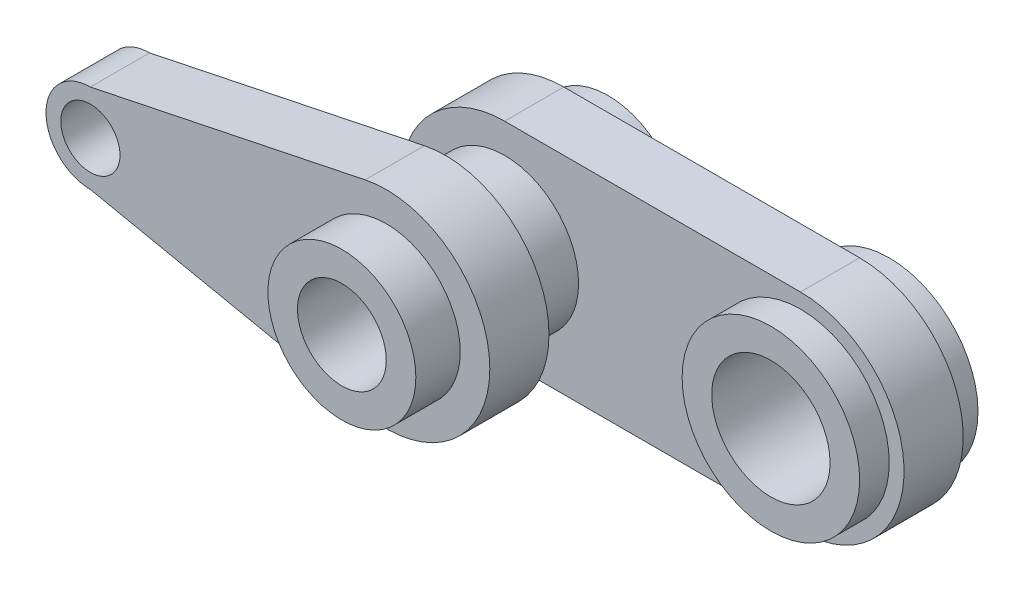
ISO-10303-21;
HEADER;
FILE_DESCRIPTION(('STEP AP214'),'2;1');
FILE_NAME('part.step','',(''),(''),'','','');
FILE_SCHEMA(('AUTOMOTIVE_DESIGN { 1 0 10303 214 1 1 1 1 }'));
ENDSEC;
DATA;
#1=APPLICATION_CONTEXT('core data for automotive mechanical design processes');
#2=APPLICATION_PROTOCOL_DEFINITION('international standard','automotive_design',2000,#1);
#3=PRODUCT_CONTEXT('',#1,'mechanical');
#4=PRODUCT('Part','Part','',(#3));
#5=PRODUCT_RELATED_PRODUCT_CATEGORY('part','',(#4));
#6=PRODUCT_DEFINITION_FORMATION('','',#4);
#7=PRODUCT_DEFINITION_CONTEXT('part definition',#1,'design');
#8=PRODUCT_DEFINITION('design','',#6,#7);
#9=PRODUCT_DEFINITION_SHAPE('','',#8);
#10=(LENGTH_UNIT() NAMED_UNIT(*) SI_UNIT(.MILLI.,.METRE.));
#11=(NAMED_UNIT(*) PLANE_ANGLE_UNIT() SI_UNIT($,.RADIAN.));
#12=(NAMED_UNIT(*) SI_UNIT($,.STERADIAN.) SOLID_ANGLE_UNIT());
#13=UNCERTAINTY_MEASURE_WITH_UNIT(LENGTH_MEASURE(1.E-05),#10,'distance_accuracy_value','');
#14=(GEOMETRIC_REPRESENTATION_CONTEXT(3) GLOBAL_UNCERTAINTY_ASSIGNED_CONTEXT((#13)) GLOBAL_UNIT_ASSIGNED_CONTEXT((#10,
#11,#12)) REPRESENTATION_CONTEXT('',''));
#15=CARTESIAN_POINT('',(0.,0.,0.));
#16=DIRECTION('',(0.,0.,1.));
#17=DIRECTION('',(1.,0.,0.));
#18=AXIS2_PLACEMENT_3D('',#15,#16,#17);
#19=CARTESIAN_POINT('',(-65.,35.,50.));
#20=DIRECTION('',(0.,0.,-1.));
#21=DIRECTION('',(-1.,0.,0.));
#22=AXIS2_PLACEMENT_3D('',#19,#20,#21);
#23=CYLINDRICAL_SURFACE('',#22,15.);
#24=CARTESIAN_POINT('',(-65.,35.,30.));
#25=DIRECTION('',(0.,0.,1.));
#26=DIRECTION('',(1.,0.,0.));
#27=AXIS2_PLACEMENT_3D('',#24,#25,#26);
#28=CIRCLE('',#27,15.);
#29=CARTESIAN_POINT('',(-65.,50.,30.));
#30=VERTEX_POINT('',#29);
#31=CARTESIAN_POINT('',(-65.,20.,30.));
#32=VERTEX_POINT('',#31);
#33=EDGE_CURVE('E118',#30,#32,#28,.T.);
#34=ORIENTED_EDGE('',*,*,#33,.T.);
#35=DIRECTION('',(0.,0.,-1.));
#36=VECTOR('',#35,1.);
#37=CARTESIAN_POINT('',(-65.,20.,50.));
#38=LINE('',#37,#36);
#39=CARTESIAN_POINT('',(-65.,20.,50.));
#40=VERTEX_POINT('',#39);
#41=EDGE_CURVE('E72',#40,#32,#38,.T.);
#42=ORIENTED_EDGE('',*,*,#41,.F.);
#43=CARTESIAN_POINT('',(-65.,35.,50.));
#44=DIRECTION('',(0.,0.,1.));
#45=DIRECTION('',(1.,0.,0.));
#46=AXIS2_PLACEMENT_3D('',#43,#44,#45);
#47=CIRCLE('',#46,15.);
#48=CARTESIAN_POINT('',(-65.,50.,50.));
#49=VERTEX_POINT('',#48);
#50=EDGE_CURVE('E109',#49,#40,#47,.T.);
#51=ORIENTED_EDGE('',*,*,#50,.F.);
#52=DIRECTION('',(0.,0.,-1.));
#53=VECTOR('',#52,1.);
#54=CARTESIAN_POINT('',(-65.,50.,50.));
#55=LINE('',#54,#53);
#56=EDGE_CURVE('E13',#49,#30,#55,.T.);
#57=ORIENTED_EDGE('',*,*,#56,.T.);
#58=EDGE_LOOP('',(#34,#42,#51,#57));
#59=FACE_BOUND('',#58,.T.);
#60=ADVANCED_FACE('F62',(#59),#23,.T.);
#61=CARTESIAN_POINT('',(1.29590710347776,6.24677964234695,50.));
#62=DIRECTION('',(0.203127144540267,0.979152369731554,0.));
#63=DIRECTION('',(-0.979152369731554,0.203127144540267,0.));
#64=AXIS2_PLACEMENT_3D('',#61,#62,#63);
#65=PLANE('',#64);
#66=DIRECTION('',(0.979152369731554,-0.203127144540267,0.));
#67=VECTOR('',#66,1.);
#68=CARTESIAN_POINT('',(1.29590710347776,6.24677964234695,30.));
#69=LINE('',#68,#67);
#70=CARTESIAN_POINT('',(27.8905499410907,0.729667059395615,30.));
#71=VERTEX_POINT('',#70);
#72=EDGE_CURVE('E96',#32,#71,#69,.T.);
#73=ORIENTED_EDGE('',*,*,#72,.T.);
#74=DIRECTION('',(0.,0.,-1.));
#75=VECTOR('',#74,1.);
#76=CARTESIAN_POINT('',(27.8905499410907,0.729667059395615,50.));
#77=LINE('',#76,#75);
#78=CARTESIAN_POINT('',(27.8905499410907,0.729667059395615,50.));
#79=VERTEX_POINT('',#78);
#80=EDGE_CURVE('E119',#79,#71,#77,.T.);
#81=ORIENTED_EDGE('',*,*,#80,.F.);
#82=DIRECTION('',(0.979152369731554,-0.203127144540267,0.));
#83=VECTOR('',#82,1.);
#84=CARTESIAN_POINT('',(1.29590710347776,6.24677964234695,50.));
#85=LINE('',#84,#83);
#86=EDGE_CURVE('E113',#40,#79,#85,.T.);
#87=ORIENTED_EDGE('',*,*,#86,.F.);
#88=ORIENTED_EDGE('',*,*,#41,.T.);
#89=EDGE_LOOP('',(#73,#81,#87,#88));
#90=FACE_BOUND('',#89,.T.);
#91=ADVANCED_FACE('F121',(#90),#65,.F.);
#92=CARTESIAN_POINT('',(35.,35.,50.));
#93=DIRECTION('',(0.,0.,-1.));
#94=DIRECTION('',(-1.,0.,0.));
#95=AXIS2_PLACEMENT_3D('',#92,#93,#94);
#96=CYLINDRICAL_SURFACE('',#95,35.);
#97=CARTESIAN_POINT('',(35.,35.,30.));
#98=DIRECTION('',(0.,0.,1.));
#99=DIRECTION('',(1.,0.,0.));
#100=AXIS2_PLACEMENT_3D('',#97,#98,#99);
#101=CIRCLE('',#100,35.);
#102=CARTESIAN_POINT('',(27.8905499410907,69.2703329406044,30.));
#103=VERTEX_POINT('',#102);
#104=EDGE_CURVE('E132',#71,#103,#101,.T.);
#105=ORIENTED_EDGE('',*,*,#104,.T.);
#106=DIRECTION('',(0.,0.,-1.));
#107=VECTOR('',#106,1.);
#108=CARTESIAN_POINT('',(27.8905499410907,69.2703329406044,50.));
#109=LINE('',#108,#107);
#110=CARTESIAN_POINT('',(27.8905499410907,69.2703329406044,50.));
#111=VERTEX_POINT('',#110);
#112=EDGE_CURVE('E103',#111,#103,#109,.T.);
#113=ORIENTED_EDGE('',*,*,#112,.F.);
#114=CARTESIAN_POINT('',(35.,35.,50.));
#115=DIRECTION('',(0.,0.,1.));
#116=DIRECTION('',(1.,0.,0.));
#117=AXIS2_PLACEMENT_3D('',#114,#115,#116);
#118=CIRCLE('',#117,35.);
#119=EDGE_CURVE('E80',#79,#111,#118,.T.);
#120=ORIENTED_EDGE('',*,*,#119,.F.);
#121=ORIENTED_EDGE('',*,*,#80,.T.);
#122=EDGE_LOOP('',(#105,#113,#120,#121));
#123=FACE_BOUND('',#122,.T.);
#124=ADVANCED_FACE('F137',(#123),#96,.T.);
#125=CARTESIAN_POINT('',(-12.6265626418607,60.8649757782173,50.));
#126=DIRECTION('',(-0.203127144540267,0.979152369731554,0.));
#127=DIRECTION('',(-0.979152369731554,-0.203127144540267,0.));
#128=AXIS2_PLACEMENT_3D('',#125,#126,#127);
#129=PLANE('',#128);
#130=DIRECTION('',(0.979152369731554,0.203127144540267,0.));
#131=VECTOR('',#130,1.);
#132=CARTESIAN_POINT('',(-12.6265626418607,60.8649757782173,30.));
#133=LINE('',#132,#131);
#134=EDGE_CURVE('E126',#30,#103,#133,.T.);
#135=ORIENTED_EDGE('',*,*,#134,.F.);
#136=ORIENTED_EDGE('',*,*,#56,.F.);
#137=DIRECTION('',(0.979152369731554,0.203127144540267,0.));
#138=VECTOR('',#137,1.);
#139=CARTESIAN_POINT('',(-12.6265626418607,60.8649757782173,50.));
#140=LINE('',#139,#138);
#141=EDGE_CURVE('E114',#49,#111,#140,.T.);
#142=ORIENTED_EDGE('',*,*,#141,.T.);
#143=ORIENTED_EDGE('',*,*,#112,.T.);
#144=EDGE_LOOP('',(#135,#136,#142,#143));
#145=FACE_BOUND('',#144,.T.);
#146=ADVANCED_FACE('F64',(#145),#129,.T.);
#147=CARTESIAN_POINT('',(0.,0.,30.));
#148=DIRECTION('',(0.,0.,1.));
#149=DIRECTION('',(1.,0.,0.));
#150=AXIS2_PLACEMENT_3D('',#147,#148,#149);
#151=PLANE('',#150);
#152=CARTESIAN_POINT('',(35.,35.,30.));
#153=DIRECTION('',(0.,0.,1.));
#154=DIRECTION('',(1.,0.,0.));
#155=AXIS2_PLACEMENT_3D('',#152,#153,#154);
#156=CIRCLE('',#155,15.);
#157=CARTESIAN_POINT('',(50.,35.,30.));
#158=VERTEX_POINT('',#157);
#159=EDGE_CURVE('E180',#158,#158,#156,.T.);
#160=ORIENTED_EDGE('',*,*,#159,.T.);
#161=EDGE_LOOP('',(#160));
#162=FACE_BOUND('',#161,.T.);
#163=CARTESIAN_POINT('',(-65.,35.,30.));
#164=DIRECTION('',(0.,0.,1.));
#165=DIRECTION('',(1.,0.,0.));
#166=AXIS2_PLACEMENT_3D('',#163,#164,#165);
#167=CIRCLE('',#166,10.);
#168=CARTESIAN_POINT('',(-55.,35.,30.));
#169=VERTEX_POINT('',#168);
#170=EDGE_CURVE('E183',#169,#169,#167,.T.);
#171=ORIENTED_EDGE('',*,*,#170,.T.);
#172=EDGE_LOOP('',(#171));
#173=FACE_BOUND('',#172,.T.);
#174=ORIENTED_EDGE('',*,*,#134,.T.);
#175=ORIENTED_EDGE('',*,*,#104,.F.);
#176=ORIENTED_EDGE('',*,*,#72,.F.);
#177=ORIENTED_EDGE('',*,*,#33,.F.);
#178=EDGE_LOOP('',(#174,#175,#176,#177));
#179=FACE_BOUND('',#178,.T.);
#180=ADVANCED_FACE('F139',(#162,#173,#179),#151,.F.);
#181=CARTESIAN_POINT('',(0.,0.,50.));
#182=DIRECTION('',(0.,0.,1.));
#183=DIRECTION('',(1.,0.,0.));
#184=AXIS2_PLACEMENT_3D('',#181,#182,#183);
#185=PLANE('',#184);
#186=CARTESIAN_POINT('',(-65.,35.,50.));
#187=DIRECTION('',(0.,0.,1.));
#188=DIRECTION('',(1.,0.,0.));
#189=AXIS2_PLACEMENT_3D('',#186,#187,#188);
#190=CIRCLE('',#189,10.);
#191=CARTESIAN_POINT('',(-55.,35.,50.));
#192=VERTEX_POINT('',#191);
#193=EDGE_CURVE('E66',#192,#192,#190,.T.);
#194=ORIENTED_EDGE('',*,*,#193,.F.);
#195=EDGE_LOOP('',(#194));
#196=FACE_BOUND('',#195,.T.);
#197=CARTESIAN_POINT('',(35.,35.,50.));
#198=DIRECTION('',(0.,0.,1.));
#199=DIRECTION('',(1.,0.,0.));
#200=AXIS2_PLACEMENT_3D('',#197,#198,#199);
#201=CIRCLE('',#200,25.);
#202=CARTESIAN_POINT('',(60.,35.,50.));
#203=VERTEX_POINT('',#202);
#204=EDGE_CURVE('E188',#203,#203,#201,.T.);
#205=ORIENTED_EDGE('',*,*,#204,.F.);
#206=EDGE_LOOP('',(#205));
#207=FACE_BOUND('',#206,.T.);
#208=ORIENTED_EDGE('',*,*,#141,.F.);
#209=ORIENTED_EDGE('',*,*,#50,.T.);
#210=ORIENTED_EDGE('',*,*,#86,.T.);
#211=ORIENTED_EDGE('',*,*,#119,.T.);
#212=EDGE_LOOP('',(#208,#209,#210,#211));
#213=FACE_BOUND('',#212,.T.);
#214=ADVANCED_FACE('F111',(#196,#207,#213),#185,.T.);
#215=CARTESIAN_POINT('',(35.,35.,65.));
#216=DIRECTION('',(0.,0.,-1.));
#217=DIRECTION('',(-1.,0.,0.));
#218=AXIS2_PLACEMENT_3D('',#215,#216,#217);
#219=CYLINDRICAL_SURFACE('',#218,25.);
#220=CARTESIAN_POINT('',(35.,35.,65.));
#221=DIRECTION('',(0.,0.,1.));
#222=DIRECTION('',(1.,0.,0.));
#223=AXIS2_PLACEMENT_3D('',#220,#221,#222);
#224=CIRCLE('',#223,25.);
#225=CARTESIAN_POINT('',(60.,35.,65.));
#226=VERTEX_POINT('',#225);
#227=EDGE_CURVE('E129',#226,#226,#224,.T.);
#228=ORIENTED_EDGE('',*,*,#227,.F.);
#229=EDGE_LOOP('',(#228));
#230=FACE_BOUND('',#229,.T.);
#231=ORIENTED_EDGE('',*,*,#204,.T.);
#232=EDGE_LOOP('',(#231));
#233=FACE_BOUND('',#232,.T.);
#234=ADVANCED_FACE('F156',(#230,#233),#219,.T.);
#235=CARTESIAN_POINT('',(35.,35.,65.));
#236=DIRECTION('',(0.,0.,1.));
#237=DIRECTION('',(1.,0.,0.));
#238=AXIS2_PLACEMENT_3D('',#235,#236,#237);
#239=PLANE('',#238);
#240=CARTESIAN_POINT('',(35.,35.,65.));
#241=DIRECTION('',(0.,0.,1.));
#242=DIRECTION('',(1.,0.,0.));
#243=AXIS2_PLACEMENT_3D('',#240,#241,#242);
#244=CIRCLE('',#243,15.);
#245=CARTESIAN_POINT('',(50.,35.,65.));
#246=VERTEX_POINT('',#245);
#247=EDGE_CURVE('E177',#246,#246,#244,.T.);
#248=ORIENTED_EDGE('',*,*,#247,.F.);
#249=EDGE_LOOP('',(#248));
#250=FACE_BOUND('',#249,.T.);
#251=ORIENTED_EDGE('',*,*,#227,.T.);
#252=EDGE_LOOP('',(#251));
#253=FACE_BOUND('',#252,.T.);
#254=ADVANCED_FACE('F160',(#250,#253),#239,.T.);
#255=CARTESIAN_POINT('',(35.,35.,-25.));
#256=DIRECTION('',(0.,0.,1.));
#257=DIRECTION('',(1.,0.,0.));
#258=AXIS2_PLACEMENT_3D('',#255,#256,#257);
#259=CYLINDRICAL_SURFACE('',#258,15.);
#260=CARTESIAN_POINT('',(50.,35.,65.));
#261=CARTESIAN_POINT('',(50.,35.,64.6354166666667));
#262=CARTESIAN_POINT('',(50.,35.,64.2708333333333));
#263=CARTESIAN_POINT('',(50.,35.,63.5416666666667));
#264=CARTESIAN_POINT('',(50.,35.,63.1770833333333));
#265=CARTESIAN_POINT('',(50.,35.,62.4479166666667));
#266=CARTESIAN_POINT('',(50.,35.,62.0833333333333));
#267=CARTESIAN_POINT('',(50.,35.,61.3541666666667));
#268=CARTESIAN_POINT('',(50.,35.,60.9895833333333));
#269=CARTESIAN_POINT('',(50.,35.,60.2604166666667));
#270=CARTESIAN_POINT('',(50.,35.,59.8958333333333));
#271=CARTESIAN_POINT('',(50.,35.,59.1666666666667));
#272=CARTESIAN_POINT('',(50.,35.,58.8020833333333));
#273=CARTESIAN_POINT('',(50.,35.,58.0729166666667));
#274=CARTESIAN_POINT('',(50.,35.,57.7083333333333));
#275=CARTESIAN_POINT('',(50.,35.,56.9791666666667));
#276=CARTESIAN_POINT('',(50.,35.,56.6145833333333));
#277=CARTESIAN_POINT('',(50.,35.,55.8854166666667));
#278=CARTESIAN_POINT('',(50.,35.,55.5208333333333));
#279=CARTESIAN_POINT('',(50.,35.,54.7916666666667));
#280=CARTESIAN_POINT('',(50.,35.,54.4270833333333));
#281=CARTESIAN_POINT('',(50.,35.,53.6979166666667));
#282=CARTESIAN_POINT('',(50.,35.,53.3333333333333));
#283=CARTESIAN_POINT('',(50.,35.,52.6041666666667));
#284=CARTESIAN_POINT('',(50.,35.,52.2395833333333));
#285=CARTESIAN_POINT('',(50.,35.,51.5104166666667));
#286=CARTESIAN_POINT('',(50.,35.,51.1458333333333));
#287=CARTESIAN_POINT('',(50.,35.,50.4166666666667));
#288=CARTESIAN_POINT('',(50.,35.,50.0520833333333));
#289=CARTESIAN_POINT('',(50.,35.,49.3229166666667));
#290=CARTESIAN_POINT('',(50.,35.,48.9583333333333));
#291=CARTESIAN_POINT('',(50.,35.,48.2291666666667));
#292=CARTESIAN_POINT('',(50.,35.,47.8645833333333));
#293=CARTESIAN_POINT('',(50.,35.,47.1354166666667));
#294=CARTESIAN_POINT('',(50.,35.,46.7708333333333));
#295=CARTESIAN_POINT('',(50.,35.,46.0416666666667));
#296=CARTESIAN_POINT('',(50.,35.,45.6770833333333));
#297=CARTESIAN_POINT('',(50.,35.,44.9479166666667));
#298=CARTESIAN_POINT('',(50.,35.,44.5833333333333));
#299=CARTESIAN_POINT('',(50.,35.,43.8541666666667));
#300=CARTESIAN_POINT('',(50.,35.,43.4895833333333));
#301=CARTESIAN_POINT('',(50.,35.,42.7604166666667));
#302=CARTESIAN_POINT('',(50.,35.,42.3958333333333));
#303=CARTESIAN_POINT('',(50.,35.,41.6666666666667));
#304=CARTESIAN_POINT('',(50.,35.,41.3020833333333));
#305=CARTESIAN_POINT('',(50.,35.,40.5729166666667));
#306=CARTESIAN_POINT('',(50.,35.,40.2083333333333));
#307=CARTESIAN_POINT('',(50.,35.,39.4791666666667));
#308=CARTESIAN_POINT('',(50.,35.,39.1145833333333));
#309=CARTESIAN_POINT('',(50.,35.,38.3854166666667));
#310=CARTESIAN_POINT('',(50.,35.,38.0208333333333));
#311=CARTESIAN_POINT('',(50.,35.,37.2916666666667));
#312=CARTESIAN_POINT('',(50.,35.,36.9270833333333));
#313=CARTESIAN_POINT('',(50.,35.,36.1979166666667));
#314=CARTESIAN_POINT('',(50.,35.,35.8333333333333));
#315=CARTESIAN_POINT('',(50.,35.,35.1041666666667));
#316=CARTESIAN_POINT('',(50.,35.,34.7395833333333));
#317=CARTESIAN_POINT('',(50.,35.,34.0104166666667));
#318=CARTESIAN_POINT('',(50.,35.,33.6458333333333));
#319=CARTESIAN_POINT('',(50.,35.,32.9166666666667));
#320=CARTESIAN_POINT('',(50.,35.,32.5520833333333));
#321=CARTESIAN_POINT('',(50.,35.,31.8229166666667));
#322=CARTESIAN_POINT('',(50.,35.,31.4583333333333));
#323=CARTESIAN_POINT('',(50.,35.,30.7291666666667));
#324=CARTESIAN_POINT('',(50.,35.,30.3645833333333));
#325=CARTESIAN_POINT('',(50.,35.,30.));
#326=B_SPLINE_CURVE_WITH_KNOTS('',3,(#260,#261,#262,#263,#264,#265,#266,#267,#268,#269,#270,
#271,#272,#273,#274,#275,#276,#277,#278,#279,#280,#281,#282,#283,#284,#285,#286,#287,#288,#289,
#290,#291,#292,#293,#294,#295,#296,#297,#298,#299,#300,#301,#302,#303,#304,#305,#306,#307,#308,
#309,#310,#311,#312,#313,#314,#315,#316,#317,#318,#319,#320,#321,#322,#323,#324,#325),
.UNSPECIFIED.,.F.,.F.,(4,2,2,2,2,2,2,2,2,2,2,2,2,2,2,2,2,2,2,2,2,2,2,2,2,2,2,2,2,2,2,2,4),(0.,
1.09375,2.1875,3.28125,4.375,5.46874999999999,6.5625,7.65625,8.75000000000001,9.84375,10.9375,
12.03125,13.125,14.21875,15.3125,16.40625,17.5,18.59375,19.6875,20.78125,21.875,22.96875,
24.0625,25.15625,26.25,27.34375,28.4375,29.53125,30.625,31.71875,32.8125,33.90625,35.),.UNSPECIFIED.);
#327=EDGE_CURVE('BSEAM164',#246,#158,#326,.T.);
#328=ORIENTED_EDGE('',*,*,#247,.T.);
#329=ORIENTED_EDGE('',*,*,#159,.F.);
#330=ORIENTED_EDGE('',*,*,#327,.T.);
#331=ORIENTED_EDGE('',*,*,#327,.F.);
#332=EDGE_LOOP('',(#328,#330,#329,#331));
#333=FACE_BOUND('',#332,.T.);
#334=ADVANCED_FACE('F164',(#333),#259,.F.);
#335=CARTESIAN_POINT('',(-65.,35.,-25.));
#336=DIRECTION('',(0.,0.,1.));
#337=DIRECTION('',(1.,0.,0.));
#338=AXIS2_PLACEMENT_3D('',#335,#336,#337);
#339=CYLINDRICAL_SURFACE('',#338,10.);
#340=CARTESIAN_POINT('',(-55.,35.,50.));
#341=CARTESIAN_POINT('',(-55.,35.,49.7916666666667));
#342=CARTESIAN_POINT('',(-55.,35.,49.5833333333333));
#343=CARTESIAN_POINT('',(-55.,35.,49.1666666666667));
#344=CARTESIAN_POINT('',(-55.,35.,48.9583333333333));
#345=CARTESIAN_POINT('',(-55.,35.,48.5416666666667));
#346=CARTESIAN_POINT('',(-55.,35.,48.3333333333333));
#347=CARTESIAN_POINT('',(-55.,35.,47.9166666666667));
#348=CARTESIAN_POINT('',(-55.,35.,47.7083333333333));
#349=CARTESIAN_POINT('',(-55.,35.,47.2916666666667));
#350=CARTESIAN_POINT('',(-55.,35.,47.0833333333333));
#351=CARTESIAN_POINT('',(-55.,35.,46.6666666666667));
#352=CARTESIAN_POINT('',(-55.,35.,46.4583333333333));
#353=CARTESIAN_POINT('',(-55.,35.,46.0416666666667));
#354=CARTESIAN_POINT('',(-55.,35.,45.8333333333333));
#355=CARTESIAN_POINT('',(-55.,35.,45.4166666666667));
#356=CARTESIAN_POINT('',(-55.,35.,45.2083333333333));
#357=CARTESIAN_POINT('',(-55.,35.,44.7916666666667));
#358=CARTESIAN_POINT('',(-55.,35.,44.5833333333333));
#359=CARTESIAN_POINT('',(-55.,35.,44.1666666666667));
#360=CARTESIAN_POINT('',(-55.,35.,43.9583333333333));
#361=CARTESIAN_POINT('',(-55.,35.,43.5416666666667));
#362=CARTESIAN_POINT('',(-55.,35.,43.3333333333333));
#363=CARTESIAN_POINT('',(-55.,35.,42.9166666666667));
#364=CARTESIAN_POINT('',(-55.,35.,42.7083333333333));
#365=CARTESIAN_POINT('',(-55.,35.,42.2916666666667));
#366=CARTESIAN_POINT('',(-55.,35.,42.0833333333333));
#367=CARTESIAN_POINT('',(-55.,35.,41.6666666666667));
#368=CARTESIAN_POINT('',(-55.,35.,41.4583333333333));
#369=CARTESIAN_POINT('',(-55.,35.,41.0416666666667));
#370=CARTESIAN_POINT('',(-55.,35.,40.8333333333333));
#371=CARTESIAN_POINT('',(-55.,35.,40.4166666666667));
#372=CARTESIAN_POINT('',(-55.,35.,40.2083333333333));
#373=CARTESIAN_POINT('',(-55.,35.,39.7916666666667));
#374=CARTESIAN_POINT('',(-55.,35.,39.5833333333333));
#375=CARTESIAN_POINT('',(-55.,35.,39.1666666666667));
#376=CARTESIAN_POINT('',(-55.,35.,38.9583333333333));
#377=CARTESIAN_POINT('',(-55.,35.,38.5416666666667));
#378=CARTESIAN_POINT('',(-55.,35.,38.3333333333333));
#379=CARTESIAN_POINT('',(-55.,35.,37.9166666666667));
#380=CARTESIAN_POINT('',(-55.,35.,37.7083333333333));
#381=CARTESIAN_POINT('',(-55.,35.,37.2916666666667));
#382=CARTESIAN_POINT('',(-55.,35.,37.0833333333333));
#383=CARTESIAN_POINT('',(-55.,35.,36.6666666666667));
#384=CARTESIAN_POINT('',(-55.,35.,36.4583333333333));
#385=CARTESIAN_POINT('',(-55.,35.,36.0416666666667));
#386=CARTESIAN_POINT('',(-55.,35.,35.8333333333333));
#387=CARTESIAN_POINT('',(-55.,35.,35.4166666666667));
#388=CARTESIAN_POINT('',(-55.,35.,35.2083333333333));
#389=CARTESIAN_POINT('',(-55.,35.,34.7916666666667));
#390=CARTESIAN_POINT('',(-55.,35.,34.5833333333333));
#391=CARTESIAN_POINT('',(-55.,35.,34.1666666666667));
#392=CARTESIAN_POINT('',(-55.,35.,33.9583333333333));
#393=CARTESIAN_POINT('',(-55.,35.,33.5416666666667));
#394=CARTESIAN_POINT('',(-55.,35.,33.3333333333333));
#395=CARTESIAN_POINT('',(-55.,35.,32.9166666666667));
#396=CARTESIAN_POINT('',(-55.,35.,32.7083333333333));
#397=CARTESIAN_POINT('',(-55.,35.,32.2916666666667));
#398=CARTESIAN_POINT('',(-55.,35.,32.0833333333333));
#399=CARTESIAN_POINT('',(-55.,35.,31.6666666666667));
#400=CARTESIAN_POINT('',(-55.,35.,31.4583333333333));
#401=CARTESIAN_POINT('',(-55.,35.,31.0416666666667));
#402=CARTESIAN_POINT('',(-55.,35.,30.8333333333333));
#403=CARTESIAN_POINT('',(-55.,35.,30.4166666666667));
#404=CARTESIAN_POINT('',(-55.,35.,30.2083333333333));
#405=CARTESIAN_POINT('',(-55.,35.,30.));
#406=B_SPLINE_CURVE_WITH_KNOTS('',3,(#340,#341,#342,#343,#344,#345,#346,#347,#348,#349,#350,
#351,#352,#353,#354,#355,#356,#357,#358,#359,#360,#361,#362,#363,#364,#365,#366,#367,#368,#369,
#370,#371,#372,#373,#374,#375,#376,#377,#378,#379,#380,#381,#382,#383,#384,#385,#386,#387,#388,
#389,#390,#391,#392,#393,#394,#395,#396,#397,#398,#399,#400,#401,#402,#403,#404,#405),
.UNSPECIFIED.,.F.,.F.,(4,2,2,2,2,2,2,2,2,2,2,2,2,2,2,2,2,2,2,2,2,2,2,2,2,2,2,2,2,2,2,2,4),(0.,
0.625000000000001,1.25,1.875,2.5,3.125,3.75,4.375,5.,5.62500000000001,6.25000000000001,
6.87500000000001,7.50000000000001,8.12500000000001,8.75000000000001,9.37500000000001,10.,10.625,
11.25,11.875,12.5,13.125,13.75,14.375,15.,15.625,16.25,16.875,17.5,18.125,18.75,19.375,20.),.UNSPECIFIED.);
#407=EDGE_CURVE('BSEAM166',#192,#169,#406,.T.);
#408=ORIENTED_EDGE('',*,*,#193,.T.);
#409=ORIENTED_EDGE('',*,*,#170,.F.);
#410=ORIENTED_EDGE('',*,*,#407,.T.);
#411=ORIENTED_EDGE('',*,*,#407,.F.);
#412=EDGE_LOOP('',(#408,#410,#409,#411));
#413=FACE_BOUND('',#412,.T.);
#414=ADVANCED_FACE('F166',(#413),#339,.F.);
#415=CLOSED_SHELL('',(#60,#91,#124,#146,#180,#214,#234,#254,#334,#414));
#416=MANIFOLD_SOLID_BREP('B2',#415);
#417=CARTESIAN_POINT('',(35.,35.,10.));
#418=DIRECTION('',(0.,0.,-1.));
#419=DIRECTION('',(-1.,0.,0.));
#420=AXIS2_PLACEMENT_3D('',#417,#418,#419);
#421=CYLINDRICAL_SURFACE('',#420,35.);
#422=DIRECTION('',(0.,0.,-1.));
#423=VECTOR('',#422,1.);
#424=CARTESIAN_POINT('',(35.,0.,10.));
#425=LINE('',#424,#423);
#426=CARTESIAN_POINT('',(35.,0.,10.));
#427=VERTEX_POINT('',#426);
#428=CARTESIAN_POINT('',(35.,0.,-10.));
#429=VERTEX_POINT('',#428);
#430=EDGE_CURVE('E323',#427,#429,#425,.T.);
#431=ORIENTED_EDGE('',*,*,#430,.F.);
#432=CARTESIAN_POINT('',(35.,35.,10.));
#433=DIRECTION('',(0.,0.,1.));
#434=DIRECTION('',(1.,0.,0.));
#435=AXIS2_PLACEMENT_3D('',#432,#433,#434);
#436=CIRCLE('',#435,35.);
#437=CARTESIAN_POINT('',(35.,70.,10.));
#438=VERTEX_POINT('',#437);
#439=EDGE_CURVE('E294',#438,#427,#436,.T.);
#440=ORIENTED_EDGE('',*,*,#439,.F.);
#441=DIRECTION('',(0.,0.,-1.));
#442=VECTOR('',#441,1.);
#443=CARTESIAN_POINT('',(35.,70.,10.));
#444=LINE('',#443,#442);
#445=CARTESIAN_POINT('',(35.,70.,-10.));
#446=VERTEX_POINT('',#445);
#447=EDGE_CURVE('E346',#446,#438,#444,.F.);
#448=ORIENTED_EDGE('',*,*,#447,.F.);
#449=CARTESIAN_POINT('',(35.,35.,-10.));
#450=DIRECTION('',(0.,0.,1.));
#451=DIRECTION('',(1.,0.,0.));
#452=AXIS2_PLACEMENT_3D('',#449,#450,#451);
#453=CIRCLE('',#452,35.);
#454=EDGE_CURVE('E287',#429,#446,#453,.F.);
#455=ORIENTED_EDGE('',*,*,#454,.F.);
#456=EDGE_LOOP('',(#431,#440,#448,#455));
#457=FACE_BOUND('',#456,.T.);
#458=ADVANCED_FACE('F270',(#457),#421,.T.);
#459=CARTESIAN_POINT('',(135.,35.,10.));
#460=DIRECTION('',(0.,0.,-1.));
#461=DIRECTION('',(-1.,0.,0.));
#462=AXIS2_PLACEMENT_3D('',#459,#460,#461);
#463=CYLINDRICAL_SURFACE('',#462,35.);
#464=DIRECTION('',(0.,0.,-1.));
#465=VECTOR('',#464,1.);
#466=CARTESIAN_POINT('',(135.,70.,10.));
#467=LINE('',#466,#465);
#468=CARTESIAN_POINT('',(135.,70.,10.));
#469=VERTEX_POINT('',#468);
#470=CARTESIAN_POINT('',(135.,70.,-10.));
#471=VERTEX_POINT('',#470);
#472=EDGE_CURVE('E319',#469,#471,#467,.T.);
#473=ORIENTED_EDGE('',*,*,#472,.F.);
#474=CARTESIAN_POINT('',(135.,35.,10.));
#475=DIRECTION('',(0.,0.,1.));
#476=DIRECTION('',(1.,0.,0.));
#477=AXIS2_PLACEMENT_3D('',#474,#475,#476);
#478=CIRCLE('',#477,35.);
#479=CARTESIAN_POINT('',(135.,0.,10.));
#480=VERTEX_POINT('',#479);
#481=EDGE_CURVE('E324',#480,#469,#478,.T.);
#482=ORIENTED_EDGE('',*,*,#481,.F.);
#483=DIRECTION('',(0.,0.,-1.));
#484=VECTOR('',#483,1.);
#485=CARTESIAN_POINT('',(135.,0.,10.));
#486=LINE('',#485,#484);
#487=CARTESIAN_POINT('',(135.,0.,-10.));
#488=VERTEX_POINT('',#487);
#489=EDGE_CURVE('E322',#488,#480,#486,.F.);
#490=ORIENTED_EDGE('',*,*,#489,.F.);
#491=CARTESIAN_POINT('',(135.,35.,-10.));
#492=DIRECTION('',(0.,0.,1.));
#493=DIRECTION('',(1.,0.,0.));
#494=AXIS2_PLACEMENT_3D('',#491,#492,#493);
#495=CIRCLE('',#494,35.);
#496=EDGE_CURVE('E315',#471,#488,#495,.F.);
#497=ORIENTED_EDGE('',*,*,#496,.F.);
#498=EDGE_LOOP('',(#473,#482,#490,#497));
#499=FACE_BOUND('',#498,.T.);
#500=ADVANCED_FACE('F317',(#499),#463,.T.);
#501=CARTESIAN_POINT('',(0.,0.,10.));
#502=DIRECTION('',(0.,1.,0.));
#503=DIRECTION('',(0.,0.,1.));
#504=AXIS2_PLACEMENT_3D('',#501,#502,#503);
#505=PLANE('',#504);
#506=DIRECTION('',(1.,0.,0.));
#507=VECTOR('',#506,1.);
#508=CARTESIAN_POINT('',(0.,0.,10.));
#509=LINE('',#508,#507);
#510=EDGE_CURVE('E334',#427,#480,#509,.T.);
#511=ORIENTED_EDGE('',*,*,#510,.F.);
#512=ORIENTED_EDGE('',*,*,#430,.T.);
#513=DIRECTION('',(1.,0.,0.));
#514=VECTOR('',#513,1.);
#515=CARTESIAN_POINT('',(0.,0.,-10.));
#516=LINE('',#515,#514);
#517=EDGE_CURVE('E335',#429,#488,#516,.T.);
#518=ORIENTED_EDGE('',*,*,#517,.T.);
#519=ORIENTED_EDGE('',*,*,#489,.T.);
#520=EDGE_LOOP('',(#511,#512,#518,#519));
#521=FACE_BOUND('',#520,.T.);
#522=ADVANCED_FACE('F385',(#521),#505,.F.);
#523=CARTESIAN_POINT('',(170.,70.,10.));
#524=DIRECTION('',(0.,-1.,0.));
#525=DIRECTION('',(0.,0.,-1.));
#526=AXIS2_PLACEMENT_3D('',#523,#524,#525);
#527=PLANE('',#526);
#528=DIRECTION('',(-1.,0.,0.));
#529=VECTOR('',#528,1.);
#530=CARTESIAN_POINT('',(170.,70.,-10.));
#531=LINE('',#530,#529);
#532=EDGE_CURVE('E329',#471,#446,#531,.T.);
#533=ORIENTED_EDGE('',*,*,#532,.T.);
#534=ORIENTED_EDGE('',*,*,#447,.T.);
#535=DIRECTION('',(-1.,0.,0.));
#536=VECTOR('',#535,1.);
#537=CARTESIAN_POINT('',(170.,70.,10.));
#538=LINE('',#537,#536);
#539=EDGE_CURVE('E331',#469,#438,#538,.T.);
#540=ORIENTED_EDGE('',*,*,#539,.F.);
#541=ORIENTED_EDGE('',*,*,#472,.T.);
#542=EDGE_LOOP('',(#533,#534,#540,#541));
#543=FACE_BOUND('',#542,.T.);
#544=ADVANCED_FACE('F328',(#543),#527,.F.);
#545=CARTESIAN_POINT('',(0.,0.,10.));
#546=DIRECTION('',(0.,0.,1.));
#547=DIRECTION('',(1.,0.,0.));
#548=AXIS2_PLACEMENT_3D('',#545,#546,#547);
#549=PLANE('',#548);
#550=CARTESIAN_POINT('',(35.,35.,10.));
#551=DIRECTION('',(0.,0.,1.));
#552=DIRECTION('',(1.,0.,0.));
#553=AXIS2_PLACEMENT_3D('',#550,#551,#552);
#554=CIRCLE('',#553,25.);
#555=CARTESIAN_POINT('',(60.,35.,10.));
#556=VERTEX_POINT('',#555);
#557=EDGE_CURVE('E60',#556,#556,#554,.T.);
#558=ORIENTED_EDGE('',*,*,#557,.F.);
#559=EDGE_LOOP('',(#558));
#560=FACE_BOUND('',#559,.T.);
#561=CARTESIAN_POINT('',(135.,35.,10.));
#562=DIRECTION('',(0.,0.,1.));
#563=DIRECTION('',(1.,0.,0.));
#564=AXIS2_PLACEMENT_3D('',#561,#562,#563);
#565=CIRCLE('',#564,30.);
#566=CARTESIAN_POINT('',(165.,35.,10.));
#567=VERTEX_POINT('',#566);
#568=EDGE_CURVE('E279',#567,#567,#565,.T.);
#569=ORIENTED_EDGE('',*,*,#568,.F.);
#570=EDGE_LOOP('',(#569));
#571=FACE_BOUND('',#570,.T.);
#572=ORIENTED_EDGE('',*,*,#539,.T.);
#573=ORIENTED_EDGE('',*,*,#439,.T.);
#574=ORIENTED_EDGE('',*,*,#510,.T.);
#575=ORIENTED_EDGE('',*,*,#481,.T.);
#576=EDGE_LOOP('',(#572,#573,#574,#575));
#577=FACE_BOUND('',#576,.T.);
#578=ADVANCED_FACE('F382',(#560,#571,#577),#549,.T.);
#579=CARTESIAN_POINT('',(0.,0.,-10.));
#580=DIRECTION('',(0.,0.,1.));
#581=DIRECTION('',(1.,0.,0.));
#582=AXIS2_PLACEMENT_3D('',#579,#580,#581);
#583=PLANE('',#582);
#584=CARTESIAN_POINT('',(35.,35.,-10.));
#585=DIRECTION('',(0.,0.,1.));
#586=DIRECTION('',(1.,0.,0.));
#587=AXIS2_PLACEMENT_3D('',#584,#585,#586);
#588=CIRCLE('',#587,25.);
#589=CARTESIAN_POINT('',(60.,35.,-10.));
#590=VERTEX_POINT('',#589);
#591=EDGE_CURVE('E353',#590,#590,#588,.T.);
#592=ORIENTED_EDGE('',*,*,#591,.T.);
#593=EDGE_LOOP('',(#592));
#594=FACE_BOUND('',#593,.T.);
#595=CARTESIAN_POINT('',(135.,35.,-10.));
#596=DIRECTION('',(0.,0.,1.));
#597=DIRECTION('',(1.,0.,0.));
#598=AXIS2_PLACEMENT_3D('',#595,#596,#597);
#599=CIRCLE('',#598,30.);
#600=CARTESIAN_POINT('',(165.,35.,-10.));
#601=VERTEX_POINT('',#600);
#602=EDGE_CURVE('E338',#601,#601,#599,.T.);
#603=ORIENTED_EDGE('',*,*,#602,.T.);
#604=EDGE_LOOP('',(#603));
#605=FACE_BOUND('',#604,.T.);
#606=ORIENTED_EDGE('',*,*,#517,.F.);
#607=ORIENTED_EDGE('',*,*,#454,.T.);
#608=ORIENTED_EDGE('',*,*,#532,.F.);
#609=ORIENTED_EDGE('',*,*,#496,.T.);
#610=EDGE_LOOP('',(#606,#607,#608,#609));
#611=FACE_BOUND('',#610,.T.);
#612=ADVANCED_FACE('F333',(#594,#605,#611),#583,.F.);
#613=CARTESIAN_POINT('',(135.,35.,-20.));
#614=DIRECTION('',(0.,0.,1.));
#615=DIRECTION('',(1.,0.,0.));
#616=AXIS2_PLACEMENT_3D('',#613,#614,#615);
#617=PLANE('',#616);
#618=CARTESIAN_POINT('',(135.,35.,-20.));
#619=DIRECTION('',(0.,0.,1.));
#620=DIRECTION('',(1.,0.,0.));
#621=AXIS2_PLACEMENT_3D('',#618,#619,#620);
#622=CIRCLE('',#621,20.);
#623=CARTESIAN_POINT('',(155.,35.,-20.));
#624=VERTEX_POINT('',#623);
#625=EDGE_CURVE('E363',#624,#624,#622,.T.);
#626=ORIENTED_EDGE('',*,*,#625,.T.);
#627=EDGE_LOOP('',(#626));
#628=FACE_BOUND('',#627,.T.);
#629=CARTESIAN_POINT('',(135.,35.,-20.));
#630=DIRECTION('',(0.,0.,1.));
#631=DIRECTION('',(1.,0.,0.));
#632=AXIS2_PLACEMENT_3D('',#629,#630,#631);
#633=CIRCLE('',#632,30.);
#634=CARTESIAN_POINT('',(165.,35.,-20.));
#635=VERTEX_POINT('',#634);
#636=EDGE_CURVE('E352',#635,#635,#633,.T.);
#637=ORIENTED_EDGE('',*,*,#636,.F.);
#638=EDGE_LOOP('',(#637));
#639=FACE_BOUND('',#638,.T.);
#640=ADVANCED_FACE('F402',(#628,#639),#617,.F.);
#641=CARTESIAN_POINT('',(135.,35.,-20.));
#642=DIRECTION('',(0.,0.,1.));
#643=DIRECTION('',(1.,0.,0.));
#644=AXIS2_PLACEMENT_3D('',#641,#642,#643);
#645=CYLINDRICAL_SURFACE('',#644,30.);
#646=ORIENTED_EDGE('',*,*,#636,.T.);
#647=EDGE_LOOP('',(#646));
#648=FACE_BOUND('',#647,.T.);
#649=ORIENTED_EDGE('',*,*,#602,.F.);
#650=EDGE_LOOP('',(#649));
#651=FACE_BOUND('',#650,.T.);
#652=ADVANCED_FACE('F411',(#648,#651),#645,.T.);
#653=ORIENTED_EDGE('',*,*,#568,.T.);
#654=EDGE_LOOP('',(#653));
#655=FACE_BOUND('',#654,.T.);
#656=CARTESIAN_POINT('',(135.,35.,20.));
#657=DIRECTION('',(0.,0.,1.));
#658=DIRECTION('',(1.,0.,0.));
#659=AXIS2_PLACEMENT_3D('',#656,#657,#658);
#660=CIRCLE('',#659,30.);
#661=CARTESIAN_POINT('',(165.,35.,20.));
#662=VERTEX_POINT('',#661);
#663=EDGE_CURVE('E355',#662,#662,#660,.T.);
#664=ORIENTED_EDGE('',*,*,#663,.F.);
#665=EDGE_LOOP('',(#664));
#666=FACE_BOUND('',#665,.T.);
#667=ADVANCED_FACE('F407',(#655,#666),#645,.T.);
#668=CARTESIAN_POINT('',(135.,35.,20.));
#669=DIRECTION('',(0.,0.,1.));
#670=DIRECTION('',(1.,0.,0.));
#671=AXIS2_PLACEMENT_3D('',#668,#669,#670);
#672=PLANE('',#671);
#673=CARTESIAN_POINT('',(135.,35.,20.));
#674=DIRECTION('',(0.,0.,1.));
#675=DIRECTION('',(1.,0.,0.));
#676=AXIS2_PLACEMENT_3D('',#673,#674,#675);
#677=CIRCLE('',#676,20.);
#678=CARTESIAN_POINT('',(155.,35.,20.));
#679=VERTEX_POINT('',#678);
#680=EDGE_CURVE('E274',#679,#679,#677,.T.);
#681=ORIENTED_EDGE('',*,*,#680,.F.);
#682=EDGE_LOOP('',(#681));
#683=FACE_BOUND('',#682,.T.);
#684=ORIENTED_EDGE('',*,*,#663,.T.);
#685=EDGE_LOOP('',(#684));
#686=FACE_BOUND('',#685,.T.);
#687=ADVANCED_FACE('F410',(#683,#686),#672,.T.);
#688=CARTESIAN_POINT('',(35.,35.,-25.));
#689=DIRECTION('',(0.,0.,1.));
#690=DIRECTION('',(1.,0.,0.));
#691=AXIS2_PLACEMENT_3D('',#688,#689,#690);
#692=PLANE('',#691);
#693=CARTESIAN_POINT('',(35.,35.,-25.));
#694=DIRECTION('',(0.,0.,1.));
#695=DIRECTION('',(1.,0.,0.));
#696=AXIS2_PLACEMENT_3D('',#693,#694,#695);
#697=CIRCLE('',#696,15.);
#698=CARTESIAN_POINT('',(50.,35.,-25.));
#699=VERTEX_POINT('',#698);
#700=EDGE_CURVE('E359',#699,#699,#697,.T.);
#701=ORIENTED_EDGE('',*,*,#700,.T.);
#702=EDGE_LOOP('',(#701));
#703=FACE_BOUND('',#702,.T.);
#704=CARTESIAN_POINT('',(35.,35.,-25.));
#705=DIRECTION('',(0.,0.,1.));
#706=DIRECTION('',(1.,0.,0.));
#707=AXIS2_PLACEMENT_3D('',#704,#705,#706);
#708=CIRCLE('',#707,25.);
#709=CARTESIAN_POINT('',(60.,35.,-25.));
#710=VERTEX_POINT('',#709);
#711=EDGE_CURVE('E356',#710,#710,#708,.T.);
#712=ORIENTED_EDGE('',*,*,#711,.F.);
#713=EDGE_LOOP('',(#712));
#714=FACE_BOUND('',#713,.T.);
#715=ADVANCED_FACE('F418',(#703,#714),#692,.F.);
#716=CARTESIAN_POINT('',(35.,35.,-25.));
#717=DIRECTION('',(0.,0.,1.));
#718=DIRECTION('',(1.,0.,0.));
#719=AXIS2_PLACEMENT_3D('',#716,#717,#718);
#720=CYLINDRICAL_SURFACE('',#719,25.);
#721=ORIENTED_EDGE('',*,*,#711,.T.);
#722=EDGE_LOOP('',(#721));
#723=FACE_BOUND('',#722,.T.);
#724=ORIENTED_EDGE('',*,*,#591,.F.);
#725=EDGE_LOOP('',(#724));
#726=FACE_BOUND('',#725,.T.);
#727=ADVANCED_FACE('F424',(#723,#726),#720,.T.);
#728=ORIENTED_EDGE('',*,*,#557,.T.);
#729=EDGE_LOOP('',(#728));
#730=FACE_BOUND('',#729,.T.);
#731=CARTESIAN_POINT('',(35.,35.,30.));
#732=DIRECTION('',(0.,0.,1.));
#733=DIRECTION('',(1.,0.,0.));
#734=AXIS2_PLACEMENT_3D('',#731,#732,#733);
#735=CIRCLE('',#734,25.);
#736=CARTESIAN_POINT('',(60.,35.,30.));
#737=VERTEX_POINT('',#736);
#738=EDGE_CURVE('E371',#737,#737,#735,.T.);
#739=ORIENTED_EDGE('',*,*,#738,.F.);
#740=EDGE_LOOP('',(#739));
#741=FACE_BOUND('',#740,.T.);
#742=ADVANCED_FACE('F420',(#730,#741),#720,.T.);
#743=CARTESIAN_POINT('',(35.,35.,30.));
#744=DIRECTION('',(0.,0.,1.));
#745=DIRECTION('',(1.,0.,0.));
#746=AXIS2_PLACEMENT_3D('',#743,#744,#745);
#747=PLANE('',#746);
#748=CARTESIAN_POINT('',(35.,35.,30.));
#749=DIRECTION('',(0.,0.,1.));
#750=DIRECTION('',(1.,0.,0.));
#751=AXIS2_PLACEMENT_3D('',#748,#749,#750);
#752=CIRCLE('',#751,15.);
#753=CARTESIAN_POINT('',(50.,35.,30.));
#754=VERTEX_POINT('',#753);
#755=EDGE_CURVE('E357',#754,#754,#752,.T.);
#756=ORIENTED_EDGE('',*,*,#755,.F.);
#757=EDGE_LOOP('',(#756));
#758=FACE_BOUND('',#757,.T.);
#759=ORIENTED_EDGE('',*,*,#738,.T.);
#760=EDGE_LOOP('',(#759));
#761=FACE_BOUND('',#760,.T.);
#762=ADVANCED_FACE('F423',(#758,#761),#747,.T.);
#763=CARTESIAN_POINT('',(35.,35.,-25.));
#764=DIRECTION('',(0.,0.,1.));
#765=DIRECTION('',(1.,0.,0.));
#766=AXIS2_PLACEMENT_3D('',#763,#764,#765);
#767=CYLINDRICAL_SURFACE('',#766,15.);
#768=CARTESIAN_POINT('',(50.,35.,30.));
#769=CARTESIAN_POINT('',(50.,35.,29.4270833333333));
#770=CARTESIAN_POINT('',(50.,35.,28.8541666666667));
#771=CARTESIAN_POINT('',(50.,35.,27.7083333333333));
#772=CARTESIAN_POINT('',(50.,35.,27.1354166666667));
#773=CARTESIAN_POINT('',(50.,35.,25.9895833333333));
#774=CARTESIAN_POINT('',(50.,35.,25.4166666666667));
#775=CARTESIAN_POINT('',(50.,35.,24.2708333333333));
#776=CARTESIAN_POINT('',(50.,35.,23.6979166666667));
#777=CARTESIAN_POINT('',(50.,35.,22.5520833333333));
#778=CARTESIAN_POINT('',(50.,35.,21.9791666666667));
#779=CARTESIAN_POINT('',(50.,35.,20.8333333333333));
#780=CARTESIAN_POINT('',(50.,35.,20.2604166666667));
#781=CARTESIAN_POINT('',(50.,35.,19.1145833333333));
#782=CARTESIAN_POINT('',(50.,35.,18.5416666666667));
#783=CARTESIAN_POINT('',(50.,35.,17.3958333333333));
#784=CARTESIAN_POINT('',(50.,35.,16.8229166666667));
#785=CARTESIAN_POINT('',(50.,35.,15.6770833333333));
#786=CARTESIAN_POINT('',(50.,35.,15.1041666666667));
#787=CARTESIAN_POINT('',(50.,35.,13.9583333333333));
#788=CARTESIAN_POINT('',(50.,35.,13.3854166666667));
#789=CARTESIAN_POINT('',(50.,35.,12.2395833333333));
#790=CARTESIAN_POINT('',(50.,35.,11.6666666666667));
#791=CARTESIAN_POINT('',(50.,35.,10.5208333333333));
#792=CARTESIAN_POINT('',(50.,35.,9.94791666666666));
#793=CARTESIAN_POINT('',(50.,35.,8.80208333333333));
#794=CARTESIAN_POINT('',(50.,35.,8.22916666666666));
#795=CARTESIAN_POINT('',(50.,35.,7.08333333333333));
#796=CARTESIAN_POINT('',(50.,35.,6.51041666666666));
#797=CARTESIAN_POINT('',(50.,35.,5.36458333333333));
#798=CARTESIAN_POINT('',(50.,35.,4.79166666666666));
#799=CARTESIAN_POINT('',(50.,35.,3.64583333333333));
#800=CARTESIAN_POINT('',(50.,35.,3.07291666666666));
#801=CARTESIAN_POINT('',(50.,35.,1.92708333333333));
#802=CARTESIAN_POINT('',(50.,35.,1.35416666666667));
#803=CARTESIAN_POINT('',(50.,35.,0.208333333333333));
#804=CARTESIAN_POINT('',(50.,35.,-0.364583333333334));
#805=CARTESIAN_POINT('',(50.,35.,-1.51041666666667));
#806=CARTESIAN_POINT('',(50.,35.,-2.08333333333334));
#807=CARTESIAN_POINT('',(50.,35.,-3.22916666666667));
#808=CARTESIAN_POINT('',(50.,35.,-3.80208333333333));
#809=CARTESIAN_POINT('',(50.,35.,-4.94791666666667));
#810=CARTESIAN_POINT('',(50.,35.,-5.52083333333333));
#811=CARTESIAN_POINT('',(50.,35.,-6.66666666666667));
#812=CARTESIAN_POINT('',(50.,35.,-7.23958333333333));
#813=CARTESIAN_POINT('',(50.,35.,-8.38541666666667));
#814=CARTESIAN_POINT('',(50.,35.,-8.95833333333333));
#815=CARTESIAN_POINT('',(50.,35.,-10.1041666666667));
#816=CARTESIAN_POINT('',(50.,35.,-10.6770833333333));
#817=CARTESIAN_POINT('',(50.,35.,-11.8229166666667));
#818=CARTESIAN_POINT('',(50.,35.,-12.3958333333333));
#819=CARTESIAN_POINT('',(50.,35.,-13.5416666666667));
#820=CARTESIAN_POINT('',(50.,35.,-14.1145833333333));
#821=CARTESIAN_POINT('',(50.,35.,-15.2604166666667));
#822=CARTESIAN_POINT('',(50.,35.,-15.8333333333333));
#823=CARTESIAN_POINT('',(50.,35.,-16.9791666666667));
#824=CARTESIAN_POINT('',(50.,35.,-17.5520833333333));
#825=CARTESIAN_POINT('',(50.,35.,-18.6979166666667));
#826=CARTESIAN_POINT('',(50.,35.,-19.2708333333333));
#827=CARTESIAN_POINT('',(50.,35.,-20.4166666666667));
#828=CARTESIAN_POINT('',(50.,35.,-20.9895833333333));
#829=CARTESIAN_POINT('',(50.,35.,-22.1354166666667));
#830=CARTESIAN_POINT('',(50.,35.,-22.7083333333333));
#831=CARTESIAN_POINT('',(50.,35.,-23.8541666666667));
#832=CARTESIAN_POINT('',(50.,35.,-24.4270833333333));
#833=CARTESIAN_POINT('',(50.,35.,-25.));
#834=B_SPLINE_CURVE_WITH_KNOTS('',3,(#768,#769,#770,#771,#772,#773,#774,#775,#776,#777,#778,
#779,#780,#781,#782,#783,#784,#785,#786,#787,#788,#789,#790,#791,#792,#793,#794,#795,#796,#797,
#798,#799,#800,#801,#802,#803,#804,#805,#806,#807,#808,#809,#810,#811,#812,#813,#814,#815,#816,
#817,#818,#819,#820,#821,#822,#823,#824,#825,#826,#827,#828,#829,#830,#831,#832,#833),
.UNSPECIFIED.,.F.,.F.,(4,2,2,2,2,2,2,2,2,2,2,2,2,2,2,2,2,2,2,2,2,2,2,2,2,2,2,2,2,2,2,2,4),(0.,
1.71875,3.4375,5.15625,6.875,8.59375,10.3125,12.03125,13.75,15.46875,17.1875,18.90625,20.625,
22.34375,24.0625,25.78125,27.5,29.21875,30.9375,32.65625,34.375,36.09375,37.8125,39.53125,41.25,
42.96875,44.6875,46.40625,48.125,49.84375,51.5625,53.28125,55.),.UNSPECIFIED.);
#835=EDGE_CURVE('BSEAM430',#754,#699,#834,.T.);
#836=ORIENTED_EDGE('',*,*,#755,.T.);
#837=ORIENTED_EDGE('',*,*,#700,.F.);
#838=ORIENTED_EDGE('',*,*,#835,.T.);
#839=ORIENTED_EDGE('',*,*,#835,.F.);
#840=EDGE_LOOP('',(#836,#838,#837,#839));
#841=FACE_BOUND('',#840,.T.);
#842=ADVANCED_FACE('F430',(#841),#767,.F.);
#843=CARTESIAN_POINT('',(135.,35.,-25.));
#844=DIRECTION('',(0.,0.,1.));
#845=DIRECTION('',(1.,0.,0.));
#846=AXIS2_PLACEMENT_3D('',#843,#844,#845);
#847=CYLINDRICAL_SURFACE('',#846,20.);
#848=CARTESIAN_POINT('',(155.,35.,20.));
#849=CARTESIAN_POINT('',(155.,35.,19.5833333333333));
#850=CARTESIAN_POINT('',(155.,35.,19.1666666666667));
#851=CARTESIAN_POINT('',(155.,35.,18.3333333333333));
#852=CARTESIAN_POINT('',(155.,35.,17.9166666666667));
#853=CARTESIAN_POINT('',(155.,35.,17.0833333333333));
#854=CARTESIAN_POINT('',(155.,35.,16.6666666666667));
#855=CARTESIAN_POINT('',(155.,35.,15.8333333333333));
#856=CARTESIAN_POINT('',(155.,35.,15.4166666666667));
#857=CARTESIAN_POINT('',(155.,35.,14.5833333333333));
#858=CARTESIAN_POINT('',(155.,35.,14.1666666666667));
#859=CARTESIAN_POINT('',(155.,35.,13.3333333333333));
#860=CARTESIAN_POINT('',(155.,35.,12.9166666666667));
#861=CARTESIAN_POINT('',(155.,35.,12.0833333333333));
#862=CARTESIAN_POINT('',(155.,35.,11.6666666666667));
#863=CARTESIAN_POINT('',(155.,35.,10.8333333333333));
#864=CARTESIAN_POINT('',(155.,35.,10.4166666666667));
#865=CARTESIAN_POINT('',(155.,35.,9.58333333333333));
#866=CARTESIAN_POINT('',(155.,35.,9.16666666666666));
#867=CARTESIAN_POINT('',(155.,35.,8.33333333333333));
#868=CARTESIAN_POINT('',(155.,35.,7.91666666666667));
#869=CARTESIAN_POINT('',(155.,35.,7.08333333333333));
#870=CARTESIAN_POINT('',(155.,35.,6.66666666666667));
#871=CARTESIAN_POINT('',(155.,35.,5.83333333333334));
#872=CARTESIAN_POINT('',(155.,35.,5.41666666666667));
#873=CARTESIAN_POINT('',(155.,35.,4.58333333333333));
#874=CARTESIAN_POINT('',(155.,35.,4.16666666666667));
#875=CARTESIAN_POINT('',(155.,35.,3.33333333333333));
#876=CARTESIAN_POINT('',(155.,35.,2.91666666666667));
#877=CARTESIAN_POINT('',(155.,35.,2.08333333333333));
#878=CARTESIAN_POINT('',(155.,35.,1.66666666666667));
#879=CARTESIAN_POINT('',(155.,35.,0.833333333333334));
#880=CARTESIAN_POINT('',(155.,35.,0.416666666666667));
#881=CARTESIAN_POINT('',(155.,35.,-0.416666666666667));
#882=CARTESIAN_POINT('',(155.,35.,-0.833333333333334));
#883=CARTESIAN_POINT('',(155.,35.,-1.66666666666667));
#884=CARTESIAN_POINT('',(155.,35.,-2.08333333333333));
#885=CARTESIAN_POINT('',(155.,35.,-2.91666666666667));
#886=CARTESIAN_POINT('',(155.,35.,-3.33333333333333));
#887=CARTESIAN_POINT('',(155.,35.,-4.16666666666667));
#888=CARTESIAN_POINT('',(155.,35.,-4.58333333333333));
#889=CARTESIAN_POINT('',(155.,35.,-5.41666666666667));
#890=CARTESIAN_POINT('',(155.,35.,-5.83333333333333));
#891=CARTESIAN_POINT('',(155.,35.,-6.66666666666667));
#892=CARTESIAN_POINT('',(155.,35.,-7.08333333333333));
#893=CARTESIAN_POINT('',(155.,35.,-7.91666666666667));
#894=CARTESIAN_POINT('',(155.,35.,-8.33333333333333));
#895=CARTESIAN_POINT('',(155.,35.,-9.16666666666667));
#896=CARTESIAN_POINT('',(155.,35.,-9.58333333333333));
#897=CARTESIAN_POINT('',(155.,35.,-10.4166666666667));
#898=CARTESIAN_POINT('',(155.,35.,-10.8333333333333));
#899=CARTESIAN_POINT('',(155.,35.,-11.6666666666667));
#900=CARTESIAN_POINT('',(155.,35.,-12.0833333333333));
#901=CARTESIAN_POINT('',(155.,35.,-12.9166666666667));
#902=CARTESIAN_POINT('',(155.,35.,-13.3333333333333));
#903=CARTESIAN_POINT('',(155.,35.,-14.1666666666667));
#904=CARTESIAN_POINT('',(155.,35.,-14.5833333333333));
#905=CARTESIAN_POINT('',(155.,35.,-15.4166666666667));
#906=CARTESIAN_POINT('',(155.,35.,-15.8333333333333));
#907=CARTESIAN_POINT('',(155.,35.,-16.6666666666667));
#908=CARTESIAN_POINT('',(155.,35.,-17.0833333333333));
#909=CARTESIAN_POINT('',(155.,35.,-17.9166666666667));
#910=CARTESIAN_POINT('',(155.,35.,-18.3333333333333));
#911=CARTESIAN_POINT('',(155.,35.,-19.1666666666667));
#912=CARTESIAN_POINT('',(155.,35.,-19.5833333333333));
#913=CARTESIAN_POINT('',(155.,35.,-20.));
#914=B_SPLINE_CURVE_WITH_KNOTS('',3,(#848,#849,#850,#851,#852,#853,#854,#855,#856,#857,#858,
#859,#860,#861,#862,#863,#864,#865,#866,#867,#868,#869,#870,#871,#872,#873,#874,#875,#876,#877,
#878,#879,#880,#881,#882,#883,#884,#885,#886,#887,#888,#889,#890,#891,#892,#893,#894,#895,#896,
#897,#898,#899,#900,#901,#902,#903,#904,#905,#906,#907,#908,#909,#910,#911,#912,#913),
.UNSPECIFIED.,.F.,.F.,(4,2,2,2,2,2,2,2,2,2,2,2,2,2,2,2,2,2,2,2,2,2,2,2,2,2,2,2,2,2,2,2,4),(0.,
1.25,2.5,3.75,5.,6.25,7.5,8.75,10.,11.25,12.5,13.75,15.,16.25,17.5,18.75,20.,21.25,22.5,23.75,
25.,26.25,27.5,28.75,30.,31.25,32.5,33.75,35.,36.25,37.5,38.75,40.),.UNSPECIFIED.);
#915=EDGE_CURVE('BSEAM432',#679,#624,#914,.T.);
#916=ORIENTED_EDGE('',*,*,#680,.T.);
#917=ORIENTED_EDGE('',*,*,#625,.F.);
#918=ORIENTED_EDGE('',*,*,#915,.T.);
#919=ORIENTED_EDGE('',*,*,#915,.F.);
#920=EDGE_LOOP('',(#916,#918,#917,#919));
#921=FACE_BOUND('',#920,.T.);
#922=ADVANCED_FACE('F432',(#921),#847,.F.);
#923=CLOSED_SHELL('',(#458,#500,#522,#544,#578,#612,#640,#652,#667,#687,#715,#727,#742,#762,
#842,#922));
#924=MANIFOLD_SOLID_BREP('B7',#923);
#925=ADVANCED_BREP_SHAPE_REPRESENTATION('',(#18,#416,#924),#14);
#926=SHAPE_DEFINITION_REPRESENTATION(#9,#925);
ENDSEC;
END-ISO-10303-21;
